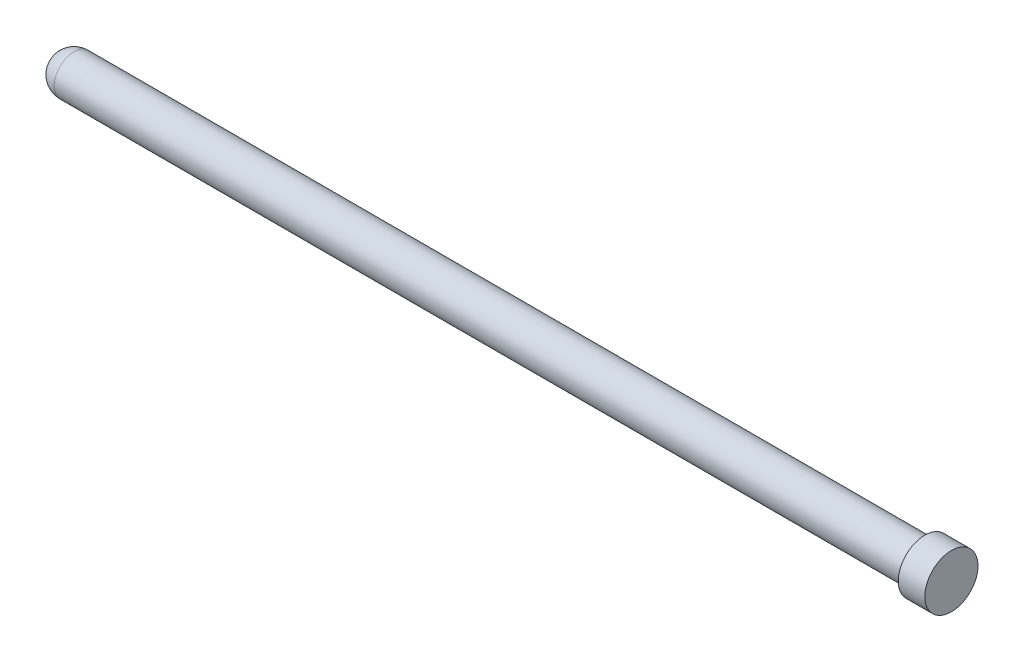
ISO-10303-21;
HEADER;
FILE_DESCRIPTION(('STEP AP214'),'2;1');
FILE_NAME('part.step','',(''),(''),'','','');
FILE_SCHEMA(('AUTOMOTIVE_DESIGN { 1 0 10303 214 1 1 1 1 }'));
ENDSEC;
DATA;
#1=APPLICATION_CONTEXT('core data for automotive mechanical design processes');
#2=APPLICATION_PROTOCOL_DEFINITION('international standard','automotive_design',2000,#1);
#3=PRODUCT_CONTEXT('',#1,'mechanical');
#4=PRODUCT('Part','Part','',(#3));
#5=PRODUCT_RELATED_PRODUCT_CATEGORY('part','',(#4));
#6=PRODUCT_DEFINITION_FORMATION('','',#4);
#7=PRODUCT_DEFINITION_CONTEXT('part definition',#1,'design');
#8=PRODUCT_DEFINITION('design','',#6,#7);
#9=PRODUCT_DEFINITION_SHAPE('','',#8);
#10=(LENGTH_UNIT() NAMED_UNIT(*) SI_UNIT(.MILLI.,.METRE.));
#11=(NAMED_UNIT(*) PLANE_ANGLE_UNIT() SI_UNIT($,.RADIAN.));
#12=(NAMED_UNIT(*) SI_UNIT($,.STERADIAN.) SOLID_ANGLE_UNIT());
#13=UNCERTAINTY_MEASURE_WITH_UNIT(LENGTH_MEASURE(1.E-05),#10,'distance_accuracy_value','');
#14=(GEOMETRIC_REPRESENTATION_CONTEXT(3) GLOBAL_UNCERTAINTY_ASSIGNED_CONTEXT((#13)) GLOBAL_UNIT_ASSIGNED_CONTEXT((#10,
#11,#12)) REPRESENTATION_CONTEXT('',''));
#15=CARTESIAN_POINT('',(0.,0.,0.));
#16=DIRECTION('',(0.,0.,1.));
#17=DIRECTION('',(1.,0.,0.));
#18=AXIS2_PLACEMENT_3D('',#15,#16,#17);
#19=CARTESIAN_POINT('',(406.4,0.,0.));
#20=DIRECTION('',(-1.,0.,0.));
#21=DIRECTION('',(0.,0.,1.));
#22=AXIS2_PLACEMENT_3D('',#19,#20,#21);
#23=CYLINDRICAL_SURFACE('',#22,9.525);
#24=CARTESIAN_POINT('',(406.4,0.,0.));
#25=DIRECTION('',(1.,0.,0.));
#26=DIRECTION('',(0.,0.,-1.));
#27=AXIS2_PLACEMENT_3D('',#24,#25,#26);
#28=CIRCLE('',#27,9.525);
#29=CARTESIAN_POINT('',(406.4,0.,-9.525));
#30=VERTEX_POINT('',#29);
#31=EDGE_CURVE('E10',#30,#30,#28,.T.);
#32=ORIENTED_EDGE('',*,*,#31,.F.);
#33=EDGE_LOOP('',(#32));
#34=FACE_BOUND('',#33,.T.);
#35=CARTESIAN_POINT('',(0.,0.,0.));
#36=DIRECTION('',(-1.,0.,0.));
#37=DIRECTION('',(0.,0.,1.));
#38=AXIS2_PLACEMENT_3D('',#35,#36,#37);
#39=CIRCLE('',#38,9.525);
#40=CARTESIAN_POINT('',(0.,0.,9.525));
#41=VERTEX_POINT('',#40);
#42=EDGE_CURVE('E37',#41,#41,#39,.T.);
#43=ORIENTED_EDGE('',*,*,#42,.F.);
#44=EDGE_LOOP('',(#43));
#45=FACE_BOUND('',#44,.T.);
#46=ADVANCED_FACE('F31',(#34,#45),#23,.T.);
#47=CARTESIAN_POINT('',(0.,0.,0.));
#48=DIRECTION('',(-1.,0.,0.));
#49=DIRECTION('',(0.,1.,0.));
#50=AXIS2_PLACEMENT_3D('',#47,#48,#49);
#51=SPHERICAL_SURFACE('',#50,9.525);
#52=ORIENTED_EDGE('',*,*,#42,.T.);
#53=EDGE_LOOP('',(#52));
#54=FACE_BOUND('',#53,.T.);
#55=ADVANCED_FACE('F64',(#54),#51,.T.);
#56=CARTESIAN_POINT('',(419.1,0.,0.));
#57=DIRECTION('',(-1.,0.,0.));
#58=DIRECTION('',(0.,0.,1.));
#59=AXIS2_PLACEMENT_3D('',#56,#57,#58);
#60=CYLINDRICAL_SURFACE('',#59,12.7);
#61=CARTESIAN_POINT('',(419.1,0.,0.));
#62=DIRECTION('',(1.,0.,0.));
#63=DIRECTION('',(0.,0.,-1.));
#64=AXIS2_PLACEMENT_3D('',#61,#62,#63);
#65=CIRCLE('',#64,12.7);
#66=CARTESIAN_POINT('',(419.1,0.,-12.7));
#67=VERTEX_POINT('',#66);
#68=EDGE_CURVE('E41',#67,#67,#65,.T.);
#69=ORIENTED_EDGE('',*,*,#68,.F.);
#70=EDGE_LOOP('',(#69));
#71=FACE_BOUND('',#70,.T.);
#72=CARTESIAN_POINT('',(406.4,0.,0.));
#73=DIRECTION('',(1.,0.,0.));
#74=DIRECTION('',(0.,0.,-1.));
#75=AXIS2_PLACEMENT_3D('',#72,#73,#74);
#76=CIRCLE('',#75,12.7);
#77=CARTESIAN_POINT('',(406.4,0.,-12.7));
#78=VERTEX_POINT('',#77);
#79=EDGE_CURVE('E45',#78,#78,#76,.T.);
#80=ORIENTED_EDGE('',*,*,#79,.T.);
#81=EDGE_LOOP('',(#80));
#82=FACE_BOUND('',#81,.T.);
#83=ADVANCED_FACE('F51',(#71,#82),#60,.T.);
#84=CARTESIAN_POINT('',(419.1,0.,0.));
#85=DIRECTION('',(1.,0.,0.));
#86=DIRECTION('',(0.,0.,-1.));
#87=AXIS2_PLACEMENT_3D('',#84,#85,#86);
#88=PLANE('',#87);
#89=ORIENTED_EDGE('',*,*,#68,.T.);
#90=EDGE_LOOP('',(#89));
#91=FACE_BOUND('',#90,.T.);
#92=ADVANCED_FACE('F55',(#91),#88,.T.);
#93=CARTESIAN_POINT('',(406.4,0.,0.));
#94=DIRECTION('',(1.,0.,0.));
#95=DIRECTION('',(0.,0.,-1.));
#96=AXIS2_PLACEMENT_3D('',#93,#94,#95);
#97=PLANE('',#96);
#98=ORIENTED_EDGE('',*,*,#31,.T.);
#99=EDGE_LOOP('',(#98));
#100=FACE_BOUND('',#99,.T.);
#101=ORIENTED_EDGE('',*,*,#79,.F.);
#102=EDGE_LOOP('',(#101));
#103=FACE_BOUND('',#102,.T.);
#104=ADVANCED_FACE('F53',(#100,#103),#97,.F.);
#105=CLOSED_SHELL('',(#46,#55,#83,#92,#104));
#106=MANIFOLD_SOLID_BREP('B2',#105);
#107=ADVANCED_BREP_SHAPE_REPRESENTATION('',(#18,#106),#14);
#108=SHAPE_DEFINITION_REPRESENTATION(#9,#107);
ENDSEC;
END-ISO-10303-21;
